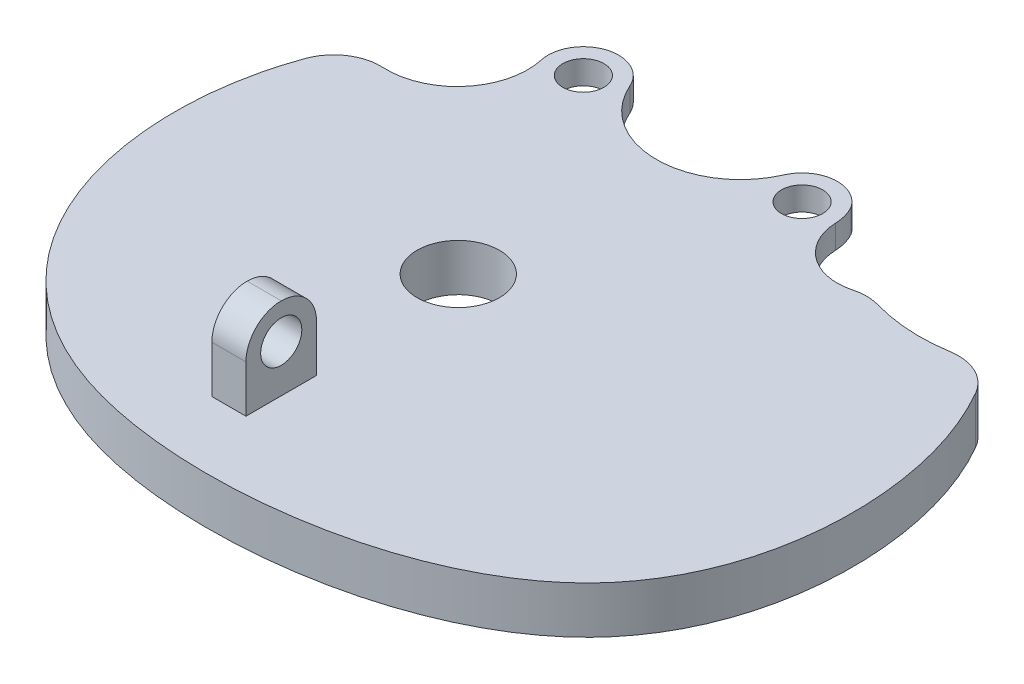
ISO-10303-21;
HEADER;
FILE_DESCRIPTION(('STEP AP214'),'2;1');
FILE_NAME('part.step','',(''),(''),'','','');
FILE_SCHEMA(('AUTOMOTIVE_DESIGN { 1 0 10303 214 1 1 1 1 }'));
ENDSEC;
DATA;
#1=APPLICATION_CONTEXT('core data for automotive mechanical design processes');
#2=APPLICATION_PROTOCOL_DEFINITION('international standard','automotive_design',2000,#1);
#3=PRODUCT_CONTEXT('',#1,'mechanical');
#4=PRODUCT('Part','Part','',(#3));
#5=PRODUCT_RELATED_PRODUCT_CATEGORY('part','',(#4));
#6=PRODUCT_DEFINITION_FORMATION('','',#4);
#7=PRODUCT_DEFINITION_CONTEXT('part definition',#1,'design');
#8=PRODUCT_DEFINITION('design','',#6,#7);
#9=PRODUCT_DEFINITION_SHAPE('','',#8);
#10=(LENGTH_UNIT() NAMED_UNIT(*) SI_UNIT(.MILLI.,.METRE.));
#11=(NAMED_UNIT(*) PLANE_ANGLE_UNIT() SI_UNIT($,.RADIAN.));
#12=(NAMED_UNIT(*) SI_UNIT($,.STERADIAN.) SOLID_ANGLE_UNIT());
#13=UNCERTAINTY_MEASURE_WITH_UNIT(LENGTH_MEASURE(1.E-05),#10,'distance_accuracy_value','');
#14=(GEOMETRIC_REPRESENTATION_CONTEXT(3) GLOBAL_UNCERTAINTY_ASSIGNED_CONTEXT((#13)) GLOBAL_UNIT_ASSIGNED_CONTEXT((#10,
#11,#12)) REPRESENTATION_CONTEXT('',''));
#15=CARTESIAN_POINT('',(0.,0.,0.));
#16=DIRECTION('',(0.,0.,1.));
#17=DIRECTION('',(1.,0.,0.));
#18=AXIS2_PLACEMENT_3D('',#15,#16,#17);
#19=CARTESIAN_POINT('',(11.2410778568125,4.,24.8480606108844));
#20=DIRECTION('',(0.,1.,0.));
#21=DIRECTION('',(0.,0.,1.));
#22=AXIS2_PLACEMENT_3D('',#19,#20,#21);
#23=PLANE('',#22);
#24=CARTESIAN_POINT('',(-5.,4.,-26.));
#25=CARTESIAN_POINT('',(9.30093151482528,4.,-30.4550670898682));
#26=CARTESIAN_POINT('',(37.8139225856591,4.,-21.5057334882719));
#27=CARTESIAN_POINT('',(32.9254211097846,4.,23.6369478182858));
#28=CARTESIAN_POINT('',(-15.2616372431777,4.,29.4250316533555));
#29=CARTESIAN_POINT('',(-30.0009183978605,4.,-3.86306555326061));
#30=CARTESIAN_POINT('',(-16.3596075726111,4.,-22.461222557559));
#31=CARTESIAN_POINT('',(-5.,4.,-26.));
#32=B_SPLINE_CURVE_WITH_KNOTS('',3,(#24,#25,#26,#27,#28,#29,#30,#31),.UNSPECIFIED.,.T.,.F.,(4,1,
1,1,1,4),(0.,0.296836272987513,0.417767995949356,0.576795532589876,0.764215109277391,1.),.UNSPECIFIED.);
#33=CARTESIAN_POINT('',(30.7630592151904,4.,-13.2382216213357));
#34=VERTEX_POINT('',#33);
#35=CARTESIAN_POINT('',(-22.3737749649327,4.,-9.36261428641886));
#36=VERTEX_POINT('',#35);
#37=EDGE_CURVE('E300',#34,#36,#32,.T.);
#38=ORIENTED_EDGE('',*,*,#37,.F.);
#39=CARTESIAN_POINT('',(27.2924419236476,4.,-11.2495497993288));
#40=DIRECTION('',(0.,1.,0.));
#41=DIRECTION('',(0.,0.,1.));
#42=AXIS2_PLACEMENT_3D('',#39,#40,#41);
#43=CIRCLE('',#42,4.);
#44=CARTESIAN_POINT('',(26.6462729956341,4.,-15.1970129994701));
#45=VERTEX_POINT('',#44);
#46=EDGE_CURVE('E474',#34,#45,#43,.T.);
#47=ORIENTED_EDGE('',*,*,#46,.T.);
#48=CARTESIAN_POINT('',(24.2231395155835,4.,-30.));
#49=DIRECTION('',(0.,1.,0.));
#50=DIRECTION('',(0.,0.,1.));
#51=AXIS2_PLACEMENT_3D('',#48,#49,#50);
#52=CIRCLE('',#51,15.);
#53=CARTESIAN_POINT('',(20.1038416036029,4.,-15.5767068700538));
#54=VERTEX_POINT('',#53);
#55=EDGE_CURVE('E240',#54,#45,#52,.T.);
#56=ORIENTED_EDGE('',*,*,#55,.F.);
#57=CARTESIAN_POINT('',(19.005362160408,4.,-11.7304953687349));
#58=DIRECTION('',(0.,1.,0.));
#59=DIRECTION('',(0.,0.,1.));
#60=AXIS2_PLACEMENT_3D('',#57,#58,#59);
#61=CIRCLE('',#60,4.);
#62=CARTESIAN_POINT('',(17.9664160888255,4.,-15.593213461004));
#63=VERTEX_POINT('',#62);
#64=EDGE_CURVE('E478',#54,#63,#61,.T.);
#65=ORIENTED_EDGE('',*,*,#64,.T.);
#66=CARTESIAN_POINT('',(16.7976017582953,4.,-19.9387713148068));
#67=DIRECTION('',(0.,1.,0.));
#68=DIRECTION('',(0.,0.,1.));
#69=AXIS2_PLACEMENT_3D('',#66,#67,#68);
#70=CIRCLE('',#69,4.5);
#71=CARTESIAN_POINT('',(12.3002344144256,4.,-19.7848655829624));
#72=VERTEX_POINT('',#71);
#73=EDGE_CURVE('E237',#72,#63,#70,.T.);
#74=ORIENTED_EDGE('',*,*,#73,.F.);
#75=CARTESIAN_POINT('',(8.30257455320808,4.,-19.6480604879895));
#76=DIRECTION('',(0.,1.,0.));
#77=DIRECTION('',(0.,0.,1.));
#78=AXIS2_PLACEMENT_3D('',#75,#76,#77);
#79=CIRCLE('',#78,4.);
#80=CARTESIAN_POINT('',(11.78519138451,4.,-21.6156427623387));
#81=VERTEX_POINT('',#80);
#82=EDGE_CURVE('E480',#72,#81,#79,.T.);
#83=ORIENTED_EDGE('',*,*,#82,.T.);
#84=CARTESIAN_POINT('',(9.29760175829526,4.,-19.9387713148064));
#85=DIRECTION('',(0.,-1.,0.));
#86=DIRECTION('',(0.,0.,1.));
#87=AXIS2_PLACEMENT_3D('',#84,#85,#86);
#88=CIRCLE('',#87,3.00000000000006);
#89=CARTESIAN_POINT('',(6.54842748458819,4.,-21.1396213523996));
#90=VERTEX_POINT('',#89);
#91=EDGE_CURVE('E251',#90,#81,#88,.T.);
#92=ORIENTED_EDGE('',*,*,#91,.F.);
#93=CARTESIAN_POINT('',(0.,4.,-24.));
#94=DIRECTION('',(0.,1.,0.));
#95=DIRECTION('',(0.,0.,1.));
#96=AXIS2_PLACEMENT_3D('',#93,#94,#95);
#97=CIRCLE('',#96,7.14588472678907);
#98=CARTESIAN_POINT('',(-6.54842748458823,4.,-21.1396213523998));
#99=VERTEX_POINT('',#98);
#100=EDGE_CURVE('E248',#99,#90,#97,.T.);
#101=ORIENTED_EDGE('',*,*,#100,.F.);
#102=CARTESIAN_POINT('',(-9.29760175829526,4.,-19.9387713148068));
#103=DIRECTION('',(0.,-1.,0.));
#104=DIRECTION('',(0.,0.,1.));
#105=AXIS2_PLACEMENT_3D('',#102,#103,#104);
#106=CIRCLE('',#105,3.);
#107=CARTESIAN_POINT('',(-12.2271668718096,4.,-19.2925142098712));
#108=VERTEX_POINT('',#107);
#109=EDGE_CURVE('E245',#108,#99,#106,.T.);
#110=ORIENTED_EDGE('',*,*,#109,.F.);
#111=CARTESIAN_POINT('',(-18.0862970988383,4.,-18.));
#112=DIRECTION('',(0.,1.,0.));
#113=DIRECTION('',(0.,0.,1.));
#114=AXIS2_PLACEMENT_3D('',#111,#112,#113);
#115=CIRCLE('',#114,6.00000000000006);
#116=CARTESIAN_POINT('',(-18.3993854799132,4.,-12.0081742627446));
#117=VERTEX_POINT('',#116);
#118=EDGE_CURVE('E243',#117,#108,#115,.T.);
#119=ORIENTED_EDGE('',*,*,#118,.F.);
#120=CARTESIAN_POINT('',(-18.6081110672965,4.,-8.01362377124099));
#121=DIRECTION('',(0.,1.,0.));
#122=DIRECTION('',(0.,0.,1.));
#123=AXIS2_PLACEMENT_3D('',#120,#121,#122);
#124=CIRCLE('',#123,4.);
#125=EDGE_CURVE('E476',#117,#36,#124,.T.);
#126=ORIENTED_EDGE('',*,*,#125,.T.);
#127=EDGE_LOOP('',(#38,#47,#56,#65,#74,#83,#92,#101,#110,#119,#126));
#128=FACE_BOUND('',#127,.T.);
#129=CARTESIAN_POINT('',(9.29760175829526,4.,-19.9387713148064));
#130=DIRECTION('',(0.,1.,0.));
#131=DIRECTION('',(0.,0.,1.));
#132=AXIS2_PLACEMENT_3D('',#129,#130,#131);
#133=CIRCLE('',#132,1.75);
#134=CARTESIAN_POINT('',(9.29760175829526,4.,-18.1887713148064));
#135=VERTEX_POINT('',#134);
#136=EDGE_CURVE('E286',#135,#135,#133,.T.);
#137=ORIENTED_EDGE('',*,*,#136,.F.);
#138=EDGE_LOOP('',(#137));
#139=FACE_BOUND('',#138,.T.);
#140=CARTESIAN_POINT('',(-9.29760175829525,4.,-19.9387713148064));
#141=DIRECTION('',(0.,1.,0.));
#142=DIRECTION('',(0.,0.,-1.));
#143=AXIS2_PLACEMENT_3D('',#140,#141,#142);
#144=CIRCLE('',#143,1.75);
#145=CARTESIAN_POINT('',(-9.29760175829525,4.,-21.6887713148064));
#146=VERTEX_POINT('',#145);
#147=EDGE_CURVE('E290',#146,#146,#144,.T.);
#148=ORIENTED_EDGE('',*,*,#147,.F.);
#149=EDGE_LOOP('',(#148));
#150=FACE_BOUND('',#149,.T.);
#151=CARTESIAN_POINT('',(0.,4.,0.));
#152=DIRECTION('',(0.,-1.,0.));
#153=DIRECTION('',(0.,0.,-1.));
#154=AXIS2_PLACEMENT_3D('',#151,#152,#153);
#155=CIRCLE('',#154,3.5);
#156=CARTESIAN_POINT('',(0.,4.,-3.5));
#157=VERTEX_POINT('',#156);
#158=EDGE_CURVE('E294',#157,#157,#155,.T.);
#159=ORIENTED_EDGE('',*,*,#158,.T.);
#160=EDGE_LOOP('',(#159));
#161=FACE_BOUND('',#160,.T.);
#162=DIRECTION('',(-1.,0.,0.));
#163=VECTOR('',#162,1.);
#164=CARTESIAN_POINT('',(-1.45,4.,13.5));
#165=LINE('',#164,#163);
#166=CARTESIAN_POINT('',(1.45,4.,13.5));
#167=VERTEX_POINT('',#166);
#168=CARTESIAN_POINT('',(-1.45,4.,13.5));
#169=VERTEX_POINT('',#168);
#170=EDGE_CURVE('E196',#167,#169,#165,.T.);
#171=ORIENTED_EDGE('',*,*,#170,.F.);
#172=DIRECTION('',(0.,0.,-1.));
#173=VECTOR('',#172,1.);
#174=CARTESIAN_POINT('',(1.45,4.,13.5));
#175=LINE('',#174,#173);
#176=CARTESIAN_POINT('',(1.45,4.,19.5));
#177=VERTEX_POINT('',#176);
#178=EDGE_CURVE('E204',#177,#167,#175,.T.);
#179=ORIENTED_EDGE('',*,*,#178,.F.);
#180=DIRECTION('',(1.,0.,0.));
#181=VECTOR('',#180,1.);
#182=CARTESIAN_POINT('',(-1.45,4.,19.5));
#183=LINE('',#182,#181);
#184=CARTESIAN_POINT('',(-1.45,4.,19.5));
#185=VERTEX_POINT('',#184);
#186=EDGE_CURVE('E215',#185,#177,#183,.T.);
#187=ORIENTED_EDGE('',*,*,#186,.F.);
#188=DIRECTION('',(0.,0.,1.));
#189=VECTOR('',#188,1.);
#190=CARTESIAN_POINT('',(-1.45,4.,13.5));
#191=LINE('',#190,#189);
#192=EDGE_CURVE('E213',#169,#185,#191,.T.);
#193=ORIENTED_EDGE('',*,*,#192,.F.);
#194=EDGE_LOOP('',(#171,#179,#187,#193));
#195=FACE_BOUND('',#194,.T.);
#196=ADVANCED_FACE('F33',(#128,#139,#150,#161,#195),#23,.T.);
#197=CARTESIAN_POINT('',(-9.29760175829525,-0.00100000000000013,-19.9387713148064));
#198=DIRECTION('',(0.,1.,0.));
#199=DIRECTION('',(0.,0.,1.));
#200=AXIS2_PLACEMENT_3D('',#197,#198,#199);
#201=CYLINDRICAL_SURFACE('',#200,1.75);
#202=ORIENTED_EDGE('',*,*,#147,.T.);
#203=EDGE_LOOP('',(#202));
#204=FACE_BOUND('',#203,.T.);
#205=CARTESIAN_POINT('',(-9.29760175829525,2.,-19.9387713148064));
#206=DIRECTION('',(0.,-1.,0.));
#207=DIRECTION('',(0.,0.,-1.));
#208=AXIS2_PLACEMENT_3D('',#205,#206,#207);
#209=CIRCLE('',#208,1.75);
#210=CARTESIAN_POINT('',(-9.29760175829525,2.,-21.6887713148064));
#211=VERTEX_POINT('',#210);
#212=EDGE_CURVE('E293',#211,#211,#209,.F.);
#213=ORIENTED_EDGE('',*,*,#212,.F.);
#214=EDGE_LOOP('',(#213));
#215=FACE_BOUND('',#214,.T.);
#216=ADVANCED_FACE('F320',(#204,#215),#201,.F.);
#217=DIRECTION('',(0.,-1.,0.));
#218=VECTOR('',#217,1.);
#219=SURFACE_OF_LINEAR_EXTRUSION('',#32,#218);
#220=CARTESIAN_POINT('',(-5.,0.,-26.));
#221=CARTESIAN_POINT('',(9.30093151482528,0.,-30.4550670898682));
#222=CARTESIAN_POINT('',(37.8139225856591,0.,-21.5057334882719));
#223=CARTESIAN_POINT('',(32.9254211097846,0.,23.6369478182858));
#224=CARTESIAN_POINT('',(-15.2616372431777,0.,29.4250316533555));
#225=CARTESIAN_POINT('',(-30.0009183978605,0.,-3.86306555326061));
#226=CARTESIAN_POINT('',(-16.3596075726111,0.,-22.461222557559));
#227=CARTESIAN_POINT('',(-5.,0.,-26.));
#228=B_SPLINE_CURVE_WITH_KNOTS('',3,(#220,#221,#222,#223,#224,#225,#226,#227),.UNSPECIFIED.,.T.,
.F.,(4,1,1,1,1,4),(0.,0.296836272987513,0.417767995949356,0.576795532589876,0.764215109277391,
1.),.UNSPECIFIED.);
#229=CARTESIAN_POINT('',(30.7630592151904,0.,-13.2382216213357));
#230=VERTEX_POINT('',#229);
#231=CARTESIAN_POINT('',(-22.3737749649275,0.,-9.36261428643321));
#232=VERTEX_POINT('',#231);
#233=EDGE_CURVE('E297',#230,#232,#228,.T.);
#234=ORIENTED_EDGE('',*,*,#233,.F.);
#235=DIRECTION('',(0.,-1.,0.));
#236=VECTOR('',#235,1.);
#237=CARTESIAN_POINT('',(30.7630592151904,0.,-13.2382216213357));
#238=LINE('',#237,#236);
#239=EDGE_CURVE('E482',#230,#34,#238,.F.);
#240=ORIENTED_EDGE('',*,*,#239,.T.);
#241=ORIENTED_EDGE('',*,*,#37,.T.);
#242=DIRECTION('',(0.,-1.,0.));
#243=VECTOR('',#242,1.);
#244=CARTESIAN_POINT('',(-22.3737749649275,4.,-9.36261428643321));
#245=LINE('',#244,#243);
#246=EDGE_CURVE('E485',#36,#232,#245,.T.);
#247=ORIENTED_EDGE('',*,*,#246,.T.);
#248=EDGE_LOOP('',(#234,#240,#241,#247));
#249=FACE_BOUND('',#248,.T.);
#250=ADVANCED_FACE('F315',(#249),#219,.T.);
#251=CARTESIAN_POINT('',(11.2410778568125,0.,24.8480606108844));
#252=DIRECTION('',(0.,1.,0.));
#253=DIRECTION('',(0.,0.,1.));
#254=AXIS2_PLACEMENT_3D('',#251,#252,#253);
#255=PLANE('',#254);
#256=CARTESIAN_POINT('',(0.,0.,0.));
#257=DIRECTION('',(0.,-1.,0.));
#258=DIRECTION('',(0.,0.,-1.));
#259=AXIS2_PLACEMENT_3D('',#256,#257,#258);
#260=CIRCLE('',#259,3.5);
#261=CARTESIAN_POINT('',(0.,0.,-3.5));
#262=VERTEX_POINT('',#261);
#263=EDGE_CURVE('E289',#262,#262,#260,.T.);
#264=ORIENTED_EDGE('',*,*,#263,.F.);
#265=EDGE_LOOP('',(#264));
#266=FACE_BOUND('',#265,.T.);
#267=CARTESIAN_POINT('',(-18.0862970988383,0.,-18.));
#268=DIRECTION('',(0.,1.,0.));
#269=DIRECTION('',(0.,0.,1.));
#270=AXIS2_PLACEMENT_3D('',#267,#268,#269);
#271=CIRCLE('',#270,6.00000000000006);
#272=CARTESIAN_POINT('',(-13.2091865757992,0.,-14.5051762639494));
#273=VERTEX_POINT('',#272);
#274=CARTESIAN_POINT('',(-18.3993854799132,0.,-12.0081742627446));
#275=VERTEX_POINT('',#274);
#276=EDGE_CURVE('E232',#273,#275,#271,.F.);
#277=ORIENTED_EDGE('',*,*,#276,.F.);
#278=CARTESIAN_POINT('',(-9.95777956043989,0.,-12.1752937732491));
#279=DIRECTION('',(0.,1.,0.));
#280=DIRECTION('',(0.,0.,1.));
#281=AXIS2_PLACEMENT_3D('',#278,#279,#280);
#282=CIRCLE('',#281,4.);
#283=CARTESIAN_POINT('',(-10.1892755539933,0.,-16.1685893552175));
#284=VERTEX_POINT('',#283);
#285=EDGE_CURVE('E510',#273,#284,#282,.F.);
#286=ORIENTED_EDGE('',*,*,#285,.T.);
#287=CARTESIAN_POINT('',(-10.5654565435175,0.,-22.6576946759162));
#288=DIRECTION('',(0.,-1.,0.));
#289=DIRECTION('',(0.,0.,-1.));
#290=AXIS2_PLACEMENT_3D('',#287,#288,#289);
#291=CIRCLE('',#290,6.5);
#292=CARTESIAN_POINT('',(-6.96449137793952,0.,-17.2463131631883));
#293=VERTEX_POINT('',#292);
#294=EDGE_CURVE('E278',#293,#284,#291,.T.);
#295=ORIENTED_EDGE('',*,*,#294,.F.);
#296=CARTESIAN_POINT('',(-4.74851281450692,0.,-13.9162322322788));
#297=DIRECTION('',(0.,1.,0.));
#298=DIRECTION('',(0.,0.,1.));
#299=AXIS2_PLACEMENT_3D('',#296,#297,#298);
#300=CIRCLE('',#299,4.);
#301=CARTESIAN_POINT('',(-3.04438149396889,0.,-17.5350630437925));
#302=VERTEX_POINT('',#301);
#303=EDGE_CURVE('E512',#293,#302,#300,.F.);
#304=ORIENTED_EDGE('',*,*,#303,.T.);
#305=CARTESIAN_POINT('',(0.,0.,-24.));
#306=DIRECTION('',(0.,1.,0.));
#307=DIRECTION('',(0.,0.,1.));
#308=AXIS2_PLACEMENT_3D('',#305,#306,#307);
#309=CIRCLE('',#308,7.14588472678907);
#310=CARTESIAN_POINT('',(3.04438149396889,0.,-17.5350630437925));
#311=VERTEX_POINT('',#310);
#312=EDGE_CURVE('E228',#311,#302,#309,.F.);
#313=ORIENTED_EDGE('',*,*,#312,.F.);
#314=CARTESIAN_POINT('',(4.74851281450692,0.,-13.9162322322788));
#315=DIRECTION('',(0.,1.,0.));
#316=DIRECTION('',(0.,0.,1.));
#317=AXIS2_PLACEMENT_3D('',#314,#315,#316);
#318=CIRCLE('',#317,4.);
#319=CARTESIAN_POINT('',(6.96449137793952,0.,-17.2463131631883));
#320=VERTEX_POINT('',#319);
#321=EDGE_CURVE('E514',#311,#320,#318,.F.);
#322=ORIENTED_EDGE('',*,*,#321,.T.);
#323=CARTESIAN_POINT('',(10.5654565435175,0.,-22.6576946759162));
#324=DIRECTION('',(0.,-1.,0.));
#325=DIRECTION('',(0.,0.,1.));
#326=AXIS2_PLACEMENT_3D('',#323,#324,#325);
#327=CIRCLE('',#326,6.5);
#328=CARTESIAN_POINT('',(11.9812068787791,0.,-16.3137486650956));
#329=VERTEX_POINT('',#328);
#330=EDGE_CURVE('E273',#329,#320,#327,.T.);
#331=ORIENTED_EDGE('',*,*,#330,.F.);
#332=CARTESIAN_POINT('',(12.8524378543247,0.,-12.409781889206));
#333=DIRECTION('',(0.,1.,0.));
#334=DIRECTION('',(0.,0.,1.));
#335=AXIS2_PLACEMENT_3D('',#332,#333,#334);
#336=CIRCLE('',#335,4.);
#337=CARTESIAN_POINT('',(14.7089855738403,0.,-15.9528357365476));
#338=VERTEX_POINT('',#337);
#339=EDGE_CURVE('E516',#329,#338,#336,.F.);
#340=ORIENTED_EDGE('',*,*,#339,.T.);
#341=CARTESIAN_POINT('',(16.7976017582953,0.,-19.9387713148068));
#342=DIRECTION('',(0.,1.,0.));
#343=DIRECTION('',(0.,0.,1.));
#344=AXIS2_PLACEMENT_3D('',#341,#342,#343);
#345=CIRCLE('',#344,4.5);
#346=CARTESIAN_POINT('',(17.9664160888255,0.,-15.593213461004));
#347=VERTEX_POINT('',#346);
#348=EDGE_CURVE('E267',#347,#338,#345,.F.);
#349=ORIENTED_EDGE('',*,*,#348,.F.);
#350=CARTESIAN_POINT('',(19.005362160408,0.,-11.7304953687349));
#351=DIRECTION('',(0.,1.,0.));
#352=DIRECTION('',(0.,0.,1.));
#353=AXIS2_PLACEMENT_3D('',#350,#351,#352);
#354=CIRCLE('',#353,4.);
#355=CARTESIAN_POINT('',(20.1038416036029,0.,-15.5767068700538));
#356=VERTEX_POINT('',#355);
#357=EDGE_CURVE('E522',#347,#356,#354,.F.);
#358=ORIENTED_EDGE('',*,*,#357,.T.);
#359=CARTESIAN_POINT('',(24.2231395155835,0.,-30.));
#360=DIRECTION('',(0.,1.,0.));
#361=DIRECTION('',(0.,0.,1.));
#362=AXIS2_PLACEMENT_3D('',#359,#360,#361);
#363=CIRCLE('',#362,15.);
#364=CARTESIAN_POINT('',(26.6462729956341,0.,-15.1970129994701));
#365=VERTEX_POINT('',#364);
#366=EDGE_CURVE('E227',#365,#356,#363,.F.);
#367=ORIENTED_EDGE('',*,*,#366,.F.);
#368=CARTESIAN_POINT('',(27.2924419236476,0.,-11.2495497993288));
#369=DIRECTION('',(0.,1.,0.));
#370=DIRECTION('',(0.,0.,1.));
#371=AXIS2_PLACEMENT_3D('',#368,#369,#370);
#372=CIRCLE('',#371,4.);
#373=EDGE_CURVE('E518',#365,#230,#372,.F.);
#374=ORIENTED_EDGE('',*,*,#373,.T.);
#375=ORIENTED_EDGE('',*,*,#233,.T.);
#376=CARTESIAN_POINT('',(-18.6081110672965,0.,-8.01362377124099));
#377=DIRECTION('',(0.,1.,0.));
#378=DIRECTION('',(0.,0.,1.));
#379=AXIS2_PLACEMENT_3D('',#376,#377,#378);
#380=CIRCLE('',#379,4.);
#381=EDGE_CURVE('E520',#232,#275,#380,.F.);
#382=ORIENTED_EDGE('',*,*,#381,.T.);
#383=EDGE_LOOP('',(#277,#286,#295,#304,#313,#322,#331,#340,#349,#358,#367,#374,#375,#382));
#384=FACE_BOUND('',#383,.T.);
#385=ADVANCED_FACE('F319',(#266,#384),#255,.F.);
#386=CARTESIAN_POINT('',(0.,4.,0.));
#387=DIRECTION('',(0.,-1.,0.));
#388=DIRECTION('',(0.,0.,-1.));
#389=AXIS2_PLACEMENT_3D('',#386,#387,#388);
#390=CYLINDRICAL_SURFACE('',#389,3.5);
#391=ORIENTED_EDGE('',*,*,#158,.F.);
#392=EDGE_LOOP('',(#391));
#393=FACE_BOUND('',#392,.T.);
#394=ORIENTED_EDGE('',*,*,#263,.T.);
#395=EDGE_LOOP('',(#394));
#396=FACE_BOUND('',#395,.T.);
#397=ADVANCED_FACE('F373',(#393,#396),#390,.F.);
#398=CARTESIAN_POINT('',(9.29760175829526,-0.00100000000000013,-19.9387713148064));
#399=DIRECTION('',(0.,1.,0.));
#400=DIRECTION('',(0.,0.,1.));
#401=AXIS2_PLACEMENT_3D('',#398,#399,#400);
#402=CYLINDRICAL_SURFACE('',#401,1.75);
#403=CARTESIAN_POINT('',(9.29760175829526,2.,-19.9387713148064));
#404=DIRECTION('',(0.,1.,0.));
#405=DIRECTION('',(0.,0.,1.));
#406=AXIS2_PLACEMENT_3D('',#403,#404,#405);
#407=CIRCLE('',#406,1.75);
#408=CARTESIAN_POINT('',(9.29760175829526,2.,-18.1887713148064));
#409=VERTEX_POINT('',#408);
#410=EDGE_CURVE('E277',#409,#409,#407,.F.);
#411=ORIENTED_EDGE('',*,*,#410,.T.);
#412=EDGE_LOOP('',(#411));
#413=FACE_BOUND('',#412,.T.);
#414=ORIENTED_EDGE('',*,*,#136,.T.);
#415=EDGE_LOOP('',(#414));
#416=FACE_BOUND('',#415,.T.);
#417=ADVANCED_FACE('F375',(#413,#416),#402,.F.);
#418=CARTESIAN_POINT('',(10.5654565435175,2.,-22.6576946759162));
#419=DIRECTION('',(0.,1.,0.));
#420=DIRECTION('',(0.,0.,1.));
#421=AXIS2_PLACEMENT_3D('',#418,#419,#420);
#422=PLANE('',#421);
#423=CARTESIAN_POINT('',(9.29760175829526,2.,-19.9387713148064));
#424=DIRECTION('',(0.,1.,0.));
#425=DIRECTION('',(0.,0.,1.));
#426=AXIS2_PLACEMENT_3D('',#423,#424,#425);
#427=CIRCLE('',#426,3.00000000000006);
#428=CARTESIAN_POINT('',(11.78519138451,2.,-21.6156427623386));
#429=VERTEX_POINT('',#428);
#430=CARTESIAN_POINT('',(6.54842748458819,2.,-21.1396213523996));
#431=VERTEX_POINT('',#430);
#432=EDGE_CURVE('E200',#429,#431,#427,.T.);
#433=ORIENTED_EDGE('',*,*,#432,.F.);
#434=CARTESIAN_POINT('',(8.30257455320808,2.,-19.6480604879895));
#435=DIRECTION('',(0.,1.,0.));
#436=DIRECTION('',(0.,0.,1.));
#437=AXIS2_PLACEMENT_3D('',#434,#435,#436);
#438=CIRCLE('',#437,4.);
#439=CARTESIAN_POINT('',(12.3002344144256,2.,-19.7848655829624));
#440=VERTEX_POINT('',#439);
#441=EDGE_CURVE('E467',#429,#440,#438,.F.);
#442=ORIENTED_EDGE('',*,*,#441,.T.);
#443=CARTESIAN_POINT('',(16.7976017582953,2.,-19.9387713148068));
#444=DIRECTION('',(0.,1.,0.));
#445=DIRECTION('',(0.,0.,1.));
#446=AXIS2_PLACEMENT_3D('',#443,#444,#445);
#447=CIRCLE('',#446,4.5);
#448=CARTESIAN_POINT('',(14.7089855738403,2.,-15.9528357365476));
#449=VERTEX_POINT('',#448);
#450=EDGE_CURVE('E258',#449,#440,#447,.F.);
#451=ORIENTED_EDGE('',*,*,#450,.F.);
#452=CARTESIAN_POINT('',(12.8524378543247,2.,-12.409781889206));
#453=DIRECTION('',(0.,1.,0.));
#454=DIRECTION('',(0.,0.,1.));
#455=AXIS2_PLACEMENT_3D('',#452,#453,#454);
#456=CIRCLE('',#455,4.);
#457=CARTESIAN_POINT('',(11.9812068787791,2.,-16.3137486650956));
#458=VERTEX_POINT('',#457);
#459=EDGE_CURVE('E457',#449,#458,#456,.T.);
#460=ORIENTED_EDGE('',*,*,#459,.T.);
#461=CARTESIAN_POINT('',(10.5654565435175,2.,-22.6576946759162));
#462=DIRECTION('',(0.,-1.,0.));
#463=DIRECTION('',(0.,0.,1.));
#464=AXIS2_PLACEMENT_3D('',#461,#462,#463);
#465=CIRCLE('',#464,6.5);
#466=CARTESIAN_POINT('',(6.96449137793952,2.,-17.2463131631883));
#467=VERTEX_POINT('',#466);
#468=EDGE_CURVE('E281',#458,#467,#465,.T.);
#469=ORIENTED_EDGE('',*,*,#468,.T.);
#470=CARTESIAN_POINT('',(4.74851281450692,2.,-13.9162322322788));
#471=DIRECTION('',(0.,1.,0.));
#472=DIRECTION('',(0.,0.,1.));
#473=AXIS2_PLACEMENT_3D('',#470,#471,#472);
#474=CIRCLE('',#473,4.);
#475=CARTESIAN_POINT('',(3.04438149396889,2.,-17.5350630437925));
#476=VERTEX_POINT('',#475);
#477=EDGE_CURVE('E459',#467,#476,#474,.T.);
#478=ORIENTED_EDGE('',*,*,#477,.T.);
#479=CARTESIAN_POINT('',(0.,2.,-24.));
#480=DIRECTION('',(0.,1.,0.));
#481=DIRECTION('',(0.,0.,1.));
#482=AXIS2_PLACEMENT_3D('',#479,#480,#481);
#483=CIRCLE('',#482,7.14588472678907);
#484=EDGE_CURVE('E225',#431,#476,#483,.F.);
#485=ORIENTED_EDGE('',*,*,#484,.F.);
#486=EDGE_LOOP('',(#433,#442,#451,#460,#469,#478,#485));
#487=FACE_BOUND('',#486,.T.);
#488=ORIENTED_EDGE('',*,*,#410,.F.);
#489=EDGE_LOOP('',(#488));
#490=FACE_BOUND('',#489,.T.);
#491=ADVANCED_FACE('F380',(#487,#490),#422,.F.);
#492=CARTESIAN_POINT('',(10.5654565435175,2.,-22.6576946759162));
#493=DIRECTION('',(0.,-1.,0.));
#494=DIRECTION('',(0.,0.,-1.));
#495=AXIS2_PLACEMENT_3D('',#492,#493,#494);
#496=CYLINDRICAL_SURFACE('',#495,6.5);
#497=ORIENTED_EDGE('',*,*,#330,.T.);
#498=DIRECTION('',(0.,-1.,0.));
#499=VECTOR('',#498,1.);
#500=CARTESIAN_POINT('',(6.96449137793952,2.,-17.2463131631883));
#501=LINE('',#500,#499);
#502=EDGE_CURVE('E496',#320,#467,#501,.F.);
#503=ORIENTED_EDGE('',*,*,#502,.T.);
#504=ORIENTED_EDGE('',*,*,#468,.F.);
#505=DIRECTION('',(0.,-1.,0.));
#506=VECTOR('',#505,1.);
#507=CARTESIAN_POINT('',(11.9812068787791,2.,-16.3137486650956));
#508=LINE('',#507,#506);
#509=EDGE_CURVE('E498',#458,#329,#508,.T.);
#510=ORIENTED_EDGE('',*,*,#509,.T.);
#511=EDGE_LOOP('',(#497,#503,#504,#510));
#512=FACE_BOUND('',#511,.T.);
#513=ADVANCED_FACE('F382',(#512),#496,.F.);
#514=CARTESIAN_POINT('',(-10.5654565435175,2.,-22.6576946759162));
#515=DIRECTION('',(0.,-1.,0.));
#516=DIRECTION('',(0.,0.,-1.));
#517=AXIS2_PLACEMENT_3D('',#514,#515,#516);
#518=PLANE('',#517);
#519=CARTESIAN_POINT('',(0.,2.,-24.));
#520=DIRECTION('',(0.,-1.,0.));
#521=DIRECTION('',(0.,0.,-1.));
#522=AXIS2_PLACEMENT_3D('',#519,#520,#521);
#523=CIRCLE('',#522,7.14588472678907);
#524=CARTESIAN_POINT('',(-6.54842748458821,2.,-21.1396213523999));
#525=VERTEX_POINT('',#524);
#526=CARTESIAN_POINT('',(-3.04438149396889,2.,-17.5350630437925));
#527=VERTEX_POINT('',#526);
#528=EDGE_CURVE('E235',#525,#527,#523,.F.);
#529=ORIENTED_EDGE('',*,*,#528,.T.);
#530=CARTESIAN_POINT('',(-4.74851281450692,2.,-13.9162322322788));
#531=DIRECTION('',(0.,-1.,0.));
#532=DIRECTION('',(0.,0.,-1.));
#533=AXIS2_PLACEMENT_3D('',#530,#531,#532);
#534=CIRCLE('',#533,4.);
#535=CARTESIAN_POINT('',(-6.96449137793952,2.,-17.2463131631883));
#536=VERTEX_POINT('',#535);
#537=EDGE_CURVE('E462',#527,#536,#534,.F.);
#538=ORIENTED_EDGE('',*,*,#537,.T.);
#539=CARTESIAN_POINT('',(-10.5654565435175,2.,-22.6576946759162));
#540=DIRECTION('',(0.,-1.,0.));
#541=DIRECTION('',(0.,0.,-1.));
#542=AXIS2_PLACEMENT_3D('',#539,#540,#541);
#543=CIRCLE('',#542,6.5);
#544=CARTESIAN_POINT('',(-10.1892755539933,2.,-16.1685893552175));
#545=VERTEX_POINT('',#544);
#546=EDGE_CURVE('E274',#536,#545,#543,.T.);
#547=ORIENTED_EDGE('',*,*,#546,.T.);
#548=CARTESIAN_POINT('',(-9.95777956043989,2.,-12.1752937732491));
#549=DIRECTION('',(0.,-1.,0.));
#550=DIRECTION('',(0.,0.,-1.));
#551=AXIS2_PLACEMENT_3D('',#548,#549,#550);
#552=CIRCLE('',#551,4.);
#553=CARTESIAN_POINT('',(-13.2091865757992,2.,-14.5051762639494));
#554=VERTEX_POINT('',#553);
#555=EDGE_CURVE('E464',#545,#554,#552,.F.);
#556=ORIENTED_EDGE('',*,*,#555,.T.);
#557=CARTESIAN_POINT('',(-18.0862970988383,2.,-18.));
#558=DIRECTION('',(0.,-1.,0.));
#559=DIRECTION('',(0.,0.,-1.));
#560=AXIS2_PLACEMENT_3D('',#557,#558,#559);
#561=CIRCLE('',#560,6.00000000000006);
#562=CARTESIAN_POINT('',(-12.2271668718095,2.,-19.2925142098712));
#563=VERTEX_POINT('',#562);
#564=EDGE_CURVE('E270',#554,#563,#561,.F.);
#565=ORIENTED_EDGE('',*,*,#564,.T.);
#566=CARTESIAN_POINT('',(-9.29760175829526,2.,-19.9387713148068));
#567=DIRECTION('',(0.,-1.,0.));
#568=DIRECTION('',(0.,0.,-1.));
#569=AXIS2_PLACEMENT_3D('',#566,#567,#568);
#570=CIRCLE('',#569,3.);
#571=EDGE_CURVE('E231',#563,#525,#570,.T.);
#572=ORIENTED_EDGE('',*,*,#571,.T.);
#573=EDGE_LOOP('',(#529,#538,#547,#556,#565,#572));
#574=FACE_BOUND('',#573,.T.);
#575=ORIENTED_EDGE('',*,*,#212,.T.);
#576=EDGE_LOOP('',(#575));
#577=FACE_BOUND('',#576,.T.);
#578=ADVANCED_FACE('F385',(#574,#577),#518,.T.);
#579=CARTESIAN_POINT('',(-10.5654565435175,2.,-22.6576946759162));
#580=DIRECTION('',(0.,-1.,0.));
#581=DIRECTION('',(0.,0.,-1.));
#582=AXIS2_PLACEMENT_3D('',#579,#580,#581);
#583=CYLINDRICAL_SURFACE('',#582,6.5);
#584=ORIENTED_EDGE('',*,*,#294,.T.);
#585=DIRECTION('',(0.,-1.,0.));
#586=VECTOR('',#585,1.);
#587=CARTESIAN_POINT('',(-10.1892755539933,2.,-16.1685893552175));
#588=LINE('',#587,#586);
#589=EDGE_CURVE('E506',#284,#545,#588,.F.);
#590=ORIENTED_EDGE('',*,*,#589,.T.);
#591=ORIENTED_EDGE('',*,*,#546,.F.);
#592=DIRECTION('',(0.,-1.,0.));
#593=VECTOR('',#592,1.);
#594=CARTESIAN_POINT('',(-6.96449137793952,2.,-17.2463131631883));
#595=LINE('',#594,#593);
#596=EDGE_CURVE('E508',#536,#293,#595,.T.);
#597=ORIENTED_EDGE('',*,*,#596,.T.);
#598=EDGE_LOOP('',(#584,#590,#591,#597));
#599=FACE_BOUND('',#598,.T.);
#600=ADVANCED_FACE('F390',(#599),#583,.F.);
#601=CARTESIAN_POINT('',(9.29760175829526,-0.00100000000000013,-19.9387713148064));
#602=DIRECTION('',(0.,1.,0.));
#603=DIRECTION('',(0.,0.,1.));
#604=AXIS2_PLACEMENT_3D('',#601,#602,#603);
#605=CYLINDRICAL_SURFACE('',#604,3.00000000000006);
#606=ORIENTED_EDGE('',*,*,#432,.T.);
#607=DIRECTION('',(0.,1.,0.));
#608=VECTOR('',#607,1.);
#609=CARTESIAN_POINT('',(6.54842748458819,-0.00100000000000013,-21.1396213523996));
#610=LINE('',#609,#608);
#611=EDGE_CURVE('E259',#431,#90,#610,.T.);
#612=ORIENTED_EDGE('',*,*,#611,.T.);
#613=ORIENTED_EDGE('',*,*,#91,.T.);
#614=DIRECTION('',(0.,1.,0.));
#615=VECTOR('',#614,1.);
#616=CARTESIAN_POINT('',(11.78519138451,-0.00100000000000013,-21.6156427623387));
#617=LINE('',#616,#615);
#618=EDGE_CURVE('E255',#429,#81,#617,.T.);
#619=ORIENTED_EDGE('',*,*,#618,.F.);
#620=EDGE_LOOP('',(#606,#612,#613,#619));
#621=FACE_BOUND('',#620,.T.);
#622=ADVANCED_FACE('F393',(#621),#605,.T.);
#623=CARTESIAN_POINT('',(0.,-0.00100000000000013,-24.));
#624=DIRECTION('',(0.,1.,0.));
#625=DIRECTION('',(0.,0.,1.));
#626=AXIS2_PLACEMENT_3D('',#623,#624,#625);
#627=CYLINDRICAL_SURFACE('',#626,7.14588472678907);
#628=ORIENTED_EDGE('',*,*,#312,.T.);
#629=DIRECTION('',(0.,1.,0.));
#630=VECTOR('',#629,1.);
#631=CARTESIAN_POINT('',(-3.04438149396889,-0.00100000000000013,-17.5350630437925));
#632=LINE('',#631,#630);
#633=EDGE_CURVE('E500',#302,#527,#632,.T.);
#634=ORIENTED_EDGE('',*,*,#633,.T.);
#635=ORIENTED_EDGE('',*,*,#528,.F.);
#636=DIRECTION('',(0.,1.,0.));
#637=VECTOR('',#636,1.);
#638=CARTESIAN_POINT('',(-6.54842748458823,-0.00100000000000013,-21.1396213523998));
#639=LINE('',#638,#637);
#640=EDGE_CURVE('E261',#525,#99,#639,.T.);
#641=ORIENTED_EDGE('',*,*,#640,.T.);
#642=ORIENTED_EDGE('',*,*,#100,.T.);
#643=ORIENTED_EDGE('',*,*,#611,.F.);
#644=ORIENTED_EDGE('',*,*,#484,.T.);
#645=DIRECTION('',(0.,1.,0.));
#646=VECTOR('',#645,1.);
#647=CARTESIAN_POINT('',(3.04438149396889,-0.00100000000000013,-17.5350630437925));
#648=LINE('',#647,#646);
#649=EDGE_CURVE('E503',#476,#311,#648,.F.);
#650=ORIENTED_EDGE('',*,*,#649,.T.);
#651=EDGE_LOOP('',(#628,#634,#635,#641,#642,#643,#644,#650));
#652=FACE_BOUND('',#651,.T.);
#653=ADVANCED_FACE('F402',(#652),#627,.F.);
#654=CARTESIAN_POINT('',(16.7976017582953,-0.00100000000000013,-19.9387713148068));
#655=DIRECTION('',(0.,1.,0.));
#656=DIRECTION('',(0.,0.,1.));
#657=AXIS2_PLACEMENT_3D('',#654,#655,#656);
#658=CYLINDRICAL_SURFACE('',#657,4.5);
#659=ORIENTED_EDGE('',*,*,#348,.T.);
#660=DIRECTION('',(0.,1.,0.));
#661=VECTOR('',#660,1.);
#662=CARTESIAN_POINT('',(14.7089855738403,-0.00100000000000013,-15.9528357365476));
#663=LINE('',#662,#661);
#664=EDGE_CURVE('E488',#338,#449,#663,.T.);
#665=ORIENTED_EDGE('',*,*,#664,.T.);
#666=ORIENTED_EDGE('',*,*,#450,.T.);
#667=DIRECTION('',(0.,1.,0.));
#668=VECTOR('',#667,1.);
#669=CARTESIAN_POINT('',(12.3002344144256,-0.00100000000000013,-19.7848655829624));
#670=LINE('',#669,#668);
#671=EDGE_CURVE('E493',#440,#72,#670,.T.);
#672=ORIENTED_EDGE('',*,*,#671,.T.);
#673=ORIENTED_EDGE('',*,*,#73,.T.);
#674=DIRECTION('',(0.,1.,0.));
#675=VECTOR('',#674,1.);
#676=CARTESIAN_POINT('',(17.9664160888255,-0.00100000000000013,-15.593213461004));
#677=LINE('',#676,#675);
#678=EDGE_CURVE('E491',#63,#347,#677,.F.);
#679=ORIENTED_EDGE('',*,*,#678,.T.);
#680=EDGE_LOOP('',(#659,#665,#666,#672,#673,#679));
#681=FACE_BOUND('',#680,.T.);
#682=ADVANCED_FACE('F398',(#681),#658,.F.);
#683=CARTESIAN_POINT('',(-9.29760175829526,-0.00100000000000013,-19.9387713148068));
#684=DIRECTION('',(0.,1.,0.));
#685=DIRECTION('',(0.,0.,1.));
#686=AXIS2_PLACEMENT_3D('',#683,#684,#685);
#687=CYLINDRICAL_SURFACE('',#686,3.);
#688=DIRECTION('',(0.,1.,0.));
#689=VECTOR('',#688,1.);
#690=CARTESIAN_POINT('',(-12.2271668718096,-0.00100000000000013,-19.2925142098712));
#691=LINE('',#690,#689);
#692=EDGE_CURVE('E254',#563,#108,#691,.T.);
#693=ORIENTED_EDGE('',*,*,#692,.T.);
#694=ORIENTED_EDGE('',*,*,#109,.T.);
#695=ORIENTED_EDGE('',*,*,#640,.F.);
#696=ORIENTED_EDGE('',*,*,#571,.F.);
#697=EDGE_LOOP('',(#693,#694,#695,#696));
#698=FACE_BOUND('',#697,.T.);
#699=ADVANCED_FACE('F401',(#698),#687,.T.);
#700=CARTESIAN_POINT('',(-18.0862970988383,-0.00100000000000013,-18.));
#701=DIRECTION('',(0.,1.,0.));
#702=DIRECTION('',(0.,0.,1.));
#703=AXIS2_PLACEMENT_3D('',#700,#701,#702);
#704=CYLINDRICAL_SURFACE('',#703,6.00000000000006);
#705=ORIENTED_EDGE('',*,*,#564,.F.);
#706=DIRECTION('',(0.,1.,0.));
#707=VECTOR('',#706,1.);
#708=CARTESIAN_POINT('',(-13.2091865757992,-0.00100000000000013,-14.5051762639494));
#709=LINE('',#708,#707);
#710=EDGE_CURVE('E524',#554,#273,#709,.F.);
#711=ORIENTED_EDGE('',*,*,#710,.T.);
#712=ORIENTED_EDGE('',*,*,#276,.T.);
#713=DIRECTION('',(0.,1.,0.));
#714=VECTOR('',#713,1.);
#715=CARTESIAN_POINT('',(-18.3993854799132,-0.00100000000000013,-12.0081742627446));
#716=LINE('',#715,#714);
#717=EDGE_CURVE('E306',#275,#117,#716,.T.);
#718=ORIENTED_EDGE('',*,*,#717,.T.);
#719=ORIENTED_EDGE('',*,*,#118,.T.);
#720=ORIENTED_EDGE('',*,*,#692,.F.);
#721=EDGE_LOOP('',(#705,#711,#712,#718,#719,#720));
#722=FACE_BOUND('',#721,.T.);
#723=ADVANCED_FACE('F406',(#722),#704,.F.);
#724=CARTESIAN_POINT('',(24.2231395155835,-0.00100000000000013,-30.));
#725=DIRECTION('',(0.,1.,0.));
#726=DIRECTION('',(0.,0.,1.));
#727=AXIS2_PLACEMENT_3D('',#724,#725,#726);
#728=CYLINDRICAL_SURFACE('',#727,15.);
#729=ORIENTED_EDGE('',*,*,#55,.T.);
#730=DIRECTION('',(0.,1.,0.));
#731=VECTOR('',#730,1.);
#732=CARTESIAN_POINT('',(26.6462729956341,-0.00100000000000013,-15.1970129994701));
#733=LINE('',#732,#731);
#734=EDGE_CURVE('E469',#45,#365,#733,.F.);
#735=ORIENTED_EDGE('',*,*,#734,.T.);
#736=ORIENTED_EDGE('',*,*,#366,.T.);
#737=DIRECTION('',(0.,1.,0.));
#738=VECTOR('',#737,1.);
#739=CARTESIAN_POINT('',(20.1038416036029,-0.00100000000000013,-15.5767068700538));
#740=LINE('',#739,#738);
#741=EDGE_CURVE('E471',#356,#54,#740,.T.);
#742=ORIENTED_EDGE('',*,*,#741,.T.);
#743=EDGE_LOOP('',(#729,#735,#736,#742));
#744=FACE_BOUND('',#743,.T.);
#745=ADVANCED_FACE('F327',(#744),#728,.F.);
#746=CARTESIAN_POINT('',(-9.95777956043989,2.,-12.1752937732491));
#747=DIRECTION('',(0.,-1.,0.));
#748=DIRECTION('',(0.,0.,-1.));
#749=AXIS2_PLACEMENT_3D('',#746,#747,#748);
#750=CYLINDRICAL_SURFACE('',#749,4.);
#751=ORIENTED_EDGE('',*,*,#555,.F.);
#752=ORIENTED_EDGE('',*,*,#589,.F.);
#753=ORIENTED_EDGE('',*,*,#285,.F.);
#754=ORIENTED_EDGE('',*,*,#710,.F.);
#755=EDGE_LOOP('',(#751,#752,#753,#754));
#756=FACE_BOUND('',#755,.T.);
#757=ADVANCED_FACE('F323',(#756),#750,.T.);
#758=CARTESIAN_POINT('',(-4.74851281450692,2.,-13.9162322322788));
#759=DIRECTION('',(0.,1.,0.));
#760=DIRECTION('',(0.,0.,1.));
#761=AXIS2_PLACEMENT_3D('',#758,#759,#760);
#762=CYLINDRICAL_SURFACE('',#761,4.);
#763=ORIENTED_EDGE('',*,*,#303,.F.);
#764=ORIENTED_EDGE('',*,*,#596,.F.);
#765=ORIENTED_EDGE('',*,*,#537,.F.);
#766=ORIENTED_EDGE('',*,*,#633,.F.);
#767=EDGE_LOOP('',(#763,#764,#765,#766));
#768=FACE_BOUND('',#767,.T.);
#769=ADVANCED_FACE('F326',(#768),#762,.T.);
#770=CARTESIAN_POINT('',(4.74851281450692,2.,-13.9162322322788));
#771=DIRECTION('',(0.,-1.,0.));
#772=DIRECTION('',(0.,0.,-1.));
#773=AXIS2_PLACEMENT_3D('',#770,#771,#772);
#774=CYLINDRICAL_SURFACE('',#773,4.);
#775=ORIENTED_EDGE('',*,*,#477,.F.);
#776=ORIENTED_EDGE('',*,*,#502,.F.);
#777=ORIENTED_EDGE('',*,*,#321,.F.);
#778=ORIENTED_EDGE('',*,*,#649,.F.);
#779=EDGE_LOOP('',(#775,#776,#777,#778));
#780=FACE_BOUND('',#779,.T.);
#781=ADVANCED_FACE('F331',(#780),#774,.T.);
#782=CARTESIAN_POINT('',(12.8524378543247,2.,-12.409781889206));
#783=DIRECTION('',(0.,1.,0.));
#784=DIRECTION('',(0.,0.,1.));
#785=AXIS2_PLACEMENT_3D('',#782,#783,#784);
#786=CYLINDRICAL_SURFACE('',#785,4.);
#787=ORIENTED_EDGE('',*,*,#339,.F.);
#788=ORIENTED_EDGE('',*,*,#509,.F.);
#789=ORIENTED_EDGE('',*,*,#459,.F.);
#790=ORIENTED_EDGE('',*,*,#664,.F.);
#791=EDGE_LOOP('',(#787,#788,#789,#790));
#792=FACE_BOUND('',#791,.T.);
#793=ADVANCED_FACE('F335',(#792),#786,.T.);
#794=CARTESIAN_POINT('',(27.2924419236476,2.,-11.2495497993288));
#795=DIRECTION('',(0.,-1.,0.));
#796=DIRECTION('',(0.,0.,-1.));
#797=AXIS2_PLACEMENT_3D('',#794,#795,#796);
#798=CYLINDRICAL_SURFACE('',#797,4.);
#799=ORIENTED_EDGE('',*,*,#373,.F.);
#800=ORIENTED_EDGE('',*,*,#734,.F.);
#801=ORIENTED_EDGE('',*,*,#46,.F.);
#802=ORIENTED_EDGE('',*,*,#239,.F.);
#803=EDGE_LOOP('',(#799,#800,#801,#802));
#804=FACE_BOUND('',#803,.T.);
#805=ADVANCED_FACE('F339',(#804),#798,.T.);
#806=CARTESIAN_POINT('',(-18.6081110672965,2.,-8.01362377124099));
#807=DIRECTION('',(0.,-1.,0.));
#808=DIRECTION('',(0.,0.,-1.));
#809=AXIS2_PLACEMENT_3D('',#806,#807,#808);
#810=CYLINDRICAL_SURFACE('',#809,4.);
#811=ORIENTED_EDGE('',*,*,#125,.F.);
#812=ORIENTED_EDGE('',*,*,#717,.F.);
#813=ORIENTED_EDGE('',*,*,#381,.F.);
#814=ORIENTED_EDGE('',*,*,#246,.F.);
#815=EDGE_LOOP('',(#811,#812,#813,#814));
#816=FACE_BOUND('',#815,.T.);
#817=ADVANCED_FACE('F343',(#816),#810,.T.);
#818=CARTESIAN_POINT('',(19.005362160408,-0.00100000000000013,-11.7304953687349));
#819=DIRECTION('',(0.,1.,0.));
#820=DIRECTION('',(0.,0.,1.));
#821=AXIS2_PLACEMENT_3D('',#818,#819,#820);
#822=CYLINDRICAL_SURFACE('',#821,4.);
#823=ORIENTED_EDGE('',*,*,#357,.F.);
#824=ORIENTED_EDGE('',*,*,#678,.F.);
#825=ORIENTED_EDGE('',*,*,#64,.F.);
#826=ORIENTED_EDGE('',*,*,#741,.F.);
#827=EDGE_LOOP('',(#823,#824,#825,#826));
#828=FACE_BOUND('',#827,.T.);
#829=ADVANCED_FACE('F347',(#828),#822,.T.);
#830=CARTESIAN_POINT('',(8.30257455320808,-0.00100000000000013,-19.6480604879895));
#831=DIRECTION('',(0.,1.,0.));
#832=DIRECTION('',(0.,0.,1.));
#833=AXIS2_PLACEMENT_3D('',#830,#831,#832);
#834=CYLINDRICAL_SURFACE('',#833,4.);
#835=ORIENTED_EDGE('',*,*,#441,.F.);
#836=ORIENTED_EDGE('',*,*,#618,.T.);
#837=ORIENTED_EDGE('',*,*,#82,.F.);
#838=ORIENTED_EDGE('',*,*,#671,.F.);
#839=EDGE_LOOP('',(#835,#836,#837,#838));
#840=FACE_BOUND('',#839,.T.);
#841=ADVANCED_FACE('F351',(#840),#834,.T.);
#842=CARTESIAN_POINT('',(1.45,11.,13.5));
#843=DIRECTION('',(-1.,0.,0.));
#844=DIRECTION('',(0.,0.,1.));
#845=AXIS2_PLACEMENT_3D('',#842,#843,#844);
#846=PLANE('',#845);
#847=CARTESIAN_POINT('',(1.45,8.,16.5));
#848=DIRECTION('',(1.,0.,0.));
#849=DIRECTION('',(0.,0.,-1.));
#850=AXIS2_PLACEMENT_3D('',#847,#848,#849);
#851=CIRCLE('',#850,1.75);
#852=CARTESIAN_POINT('',(1.45,8.,14.75));
#853=VERTEX_POINT('',#852);
#854=EDGE_CURVE('E440',#853,#853,#851,.T.);
#855=ORIENTED_EDGE('',*,*,#854,.F.);
#856=EDGE_LOOP('',(#855));
#857=FACE_BOUND('',#856,.T.);
#858=DIRECTION('',(0.,-1.,0.));
#859=VECTOR('',#858,1.);
#860=CARTESIAN_POINT('',(1.45,11.,13.5));
#861=LINE('',#860,#859);
#862=CARTESIAN_POINT('',(1.45,8.,13.5));
#863=VERTEX_POINT('',#862);
#864=EDGE_CURVE('E191',#863,#167,#861,.T.);
#865=ORIENTED_EDGE('',*,*,#864,.F.);
#866=CARTESIAN_POINT('',(1.45,8.,16.5));
#867=DIRECTION('',(-1.,0.,0.));
#868=DIRECTION('',(0.,0.,1.));
#869=AXIS2_PLACEMENT_3D('',#866,#867,#868);
#870=CIRCLE('',#869,3.);
#871=CARTESIAN_POINT('',(1.45,11.,16.5));
#872=VERTEX_POINT('',#871);
#873=EDGE_CURVE('E42',#863,#872,#870,.F.);
#874=ORIENTED_EDGE('',*,*,#873,.T.);
#875=CARTESIAN_POINT('',(1.45,8.,16.5));
#876=DIRECTION('',(-1.,0.,0.));
#877=DIRECTION('',(0.,0.,1.));
#878=AXIS2_PLACEMENT_3D('',#875,#876,#877);
#879=CIRCLE('',#878,3.);
#880=CARTESIAN_POINT('',(1.45,8.,19.5));
#881=VERTEX_POINT('',#880);
#882=EDGE_CURVE('E49',#872,#881,#879,.F.);
#883=ORIENTED_EDGE('',*,*,#882,.T.);
#884=DIRECTION('',(0.,-1.,0.));
#885=VECTOR('',#884,1.);
#886=CARTESIAN_POINT('',(1.45,11.,19.5));
#887=LINE('',#886,#885);
#888=EDGE_CURVE('E206',#881,#177,#887,.T.);
#889=ORIENTED_EDGE('',*,*,#888,.T.);
#890=ORIENTED_EDGE('',*,*,#178,.T.);
#891=EDGE_LOOP('',(#865,#874,#883,#889,#890));
#892=FACE_BOUND('',#891,.T.);
#893=ADVANCED_FACE('F205',(#857,#892),#846,.F.);
#894=CARTESIAN_POINT('',(-1.45,11.,13.5));
#895=DIRECTION('',(0.,0.,1.));
#896=DIRECTION('',(1.,0.,0.));
#897=AXIS2_PLACEMENT_3D('',#894,#895,#896);
#898=PLANE('',#897);
#899=DIRECTION('',(0.,-1.,0.));
#900=VECTOR('',#899,1.);
#901=CARTESIAN_POINT('',(-1.45,11.,13.5));
#902=LINE('',#901,#900);
#903=CARTESIAN_POINT('',(-1.45,8.,13.5));
#904=VERTEX_POINT('',#903);
#905=EDGE_CURVE('E201',#904,#169,#902,.T.);
#906=ORIENTED_EDGE('',*,*,#905,.F.);
#907=DIRECTION('',(-1.,0.,0.));
#908=VECTOR('',#907,1.);
#909=CARTESIAN_POINT('',(1.45,8.,13.5));
#910=LINE('',#909,#908);
#911=EDGE_CURVE('E199',#904,#863,#910,.F.);
#912=ORIENTED_EDGE('',*,*,#911,.T.);
#913=ORIENTED_EDGE('',*,*,#864,.T.);
#914=ORIENTED_EDGE('',*,*,#170,.T.);
#915=EDGE_LOOP('',(#906,#912,#913,#914));
#916=FACE_BOUND('',#915,.T.);
#917=ADVANCED_FACE('F194',(#916),#898,.F.);
#918=CARTESIAN_POINT('',(-1.45,11.,13.5));
#919=DIRECTION('',(1.,0.,0.));
#920=DIRECTION('',(0.,0.,-1.));
#921=AXIS2_PLACEMENT_3D('',#918,#919,#920);
#922=PLANE('',#921);
#923=CARTESIAN_POINT('',(-1.45,8.,16.5));
#924=DIRECTION('',(1.,0.,0.));
#925=DIRECTION('',(0.,0.,-1.));
#926=AXIS2_PLACEMENT_3D('',#923,#924,#925);
#927=CIRCLE('',#926,1.75);
#928=CARTESIAN_POINT('',(-1.45,8.,14.75));
#929=VERTEX_POINT('',#928);
#930=EDGE_CURVE('E210',#929,#929,#927,.F.);
#931=ORIENTED_EDGE('',*,*,#930,.F.);
#932=EDGE_LOOP('',(#931));
#933=FACE_BOUND('',#932,.T.);
#934=CARTESIAN_POINT('',(-1.45,8.,16.5));
#935=DIRECTION('',(1.,0.,0.));
#936=DIRECTION('',(0.,0.,-1.));
#937=AXIS2_PLACEMENT_3D('',#934,#935,#936);
#938=CIRCLE('',#937,3.);
#939=CARTESIAN_POINT('',(-1.45,8.,19.5));
#940=VERTEX_POINT('',#939);
#941=CARTESIAN_POINT('',(-1.45,11.,16.5));
#942=VERTEX_POINT('',#941);
#943=EDGE_CURVE('E450',#940,#942,#938,.F.);
#944=ORIENTED_EDGE('',*,*,#943,.T.);
#945=CARTESIAN_POINT('',(-1.45,8.,16.5));
#946=DIRECTION('',(1.,0.,0.));
#947=DIRECTION('',(0.,0.,-1.));
#948=AXIS2_PLACEMENT_3D('',#945,#946,#947);
#949=CIRCLE('',#948,3.);
#950=EDGE_CURVE('E447',#942,#904,#949,.F.);
#951=ORIENTED_EDGE('',*,*,#950,.T.);
#952=ORIENTED_EDGE('',*,*,#905,.T.);
#953=ORIENTED_EDGE('',*,*,#192,.T.);
#954=DIRECTION('',(0.,-1.,0.));
#955=VECTOR('',#954,1.);
#956=CARTESIAN_POINT('',(-1.45,11.,19.5));
#957=LINE('',#956,#955);
#958=EDGE_CURVE('E221',#940,#185,#957,.T.);
#959=ORIENTED_EDGE('',*,*,#958,.F.);
#960=EDGE_LOOP('',(#944,#951,#952,#953,#959));
#961=FACE_BOUND('',#960,.T.);
#962=ADVANCED_FACE('F425',(#933,#961),#922,.F.);
#963=CARTESIAN_POINT('',(-1.45,11.,19.5));
#964=DIRECTION('',(0.,0.,-1.));
#965=DIRECTION('',(-1.,0.,0.));
#966=AXIS2_PLACEMENT_3D('',#963,#964,#965);
#967=PLANE('',#966);
#968=ORIENTED_EDGE('',*,*,#888,.F.);
#969=DIRECTION('',(1.,0.,0.));
#970=VECTOR('',#969,1.);
#971=CARTESIAN_POINT('',(-1.45,8.,19.5));
#972=LINE('',#971,#970);
#973=EDGE_CURVE('E11',#881,#940,#972,.F.);
#974=ORIENTED_EDGE('',*,*,#973,.T.);
#975=ORIENTED_EDGE('',*,*,#958,.T.);
#976=ORIENTED_EDGE('',*,*,#186,.T.);
#977=EDGE_LOOP('',(#968,#974,#975,#976));
#978=FACE_BOUND('',#977,.T.);
#979=ADVANCED_FACE('F428',(#978),#967,.F.);
#980=CARTESIAN_POINT('',(-25.6523866411789,8.,16.5));
#981=DIRECTION('',(1.,0.,0.));
#982=DIRECTION('',(0.,0.,-1.));
#983=AXIS2_PLACEMENT_3D('',#980,#981,#982);
#984=CYLINDRICAL_SURFACE('',#983,1.75);
#985=CARTESIAN_POINT('',(1.45,8.,14.75));
#986=CARTESIAN_POINT('',(1.41979166666667,8.,14.75));
#987=CARTESIAN_POINT('',(1.38958333333334,8.,14.75));
#988=CARTESIAN_POINT('',(1.32916666666667,8.,14.75));
#989=CARTESIAN_POINT('',(1.29895833333334,8.,14.75));
#990=CARTESIAN_POINT('',(1.23854166666667,8.,14.75));
#991=CARTESIAN_POINT('',(1.20833333333334,8.,14.75));
#992=CARTESIAN_POINT('',(1.14791666666667,8.,14.75));
#993=CARTESIAN_POINT('',(1.11770833333334,8.,14.75));
#994=CARTESIAN_POINT('',(1.05729166666667,8.,14.75));
#995=CARTESIAN_POINT('',(1.02708333333333,8.,14.75));
#996=CARTESIAN_POINT('',(0.966666666666668,8.,14.75));
#997=CARTESIAN_POINT('',(0.936458333333334,8.,14.75));
#998=CARTESIAN_POINT('',(0.876041666666667,8.,14.75));
#999=CARTESIAN_POINT('',(0.845833333333334,8.,14.75));
#1000=CARTESIAN_POINT('',(0.785416666666667,8.,14.75));
#1001=CARTESIAN_POINT('',(0.755208333333333,8.,14.75));
#1002=CARTESIAN_POINT('',(0.694791666666668,8.,14.75));
#1003=CARTESIAN_POINT('',(0.664583333333335,8.,14.75));
#1004=CARTESIAN_POINT('',(0.60416666666667,8.,14.75));
#1005=CARTESIAN_POINT('',(0.573958333333336,8.,14.75));
#1006=CARTESIAN_POINT('',(0.513541666666669,8.,14.75));
#1007=CARTESIAN_POINT('',(0.483333333333336,8.,14.75));
#1008=CARTESIAN_POINT('',(0.422916666666669,8.,14.75));
#1009=CARTESIAN_POINT('',(0.392708333333335,8.,14.75));
#1010=CARTESIAN_POINT('',(0.332291666666668,8.,14.75));
#1011=CARTESIAN_POINT('',(0.302083333333335,8.,14.75));
#1012=CARTESIAN_POINT('',(0.241666666666668,8.,14.75));
#1013=CARTESIAN_POINT('',(0.211458333333334,8.,14.75));
#1014=CARTESIAN_POINT('',(0.151041666666667,8.,14.75));
#1015=CARTESIAN_POINT('',(0.120833333333334,8.,14.75));
#1016=CARTESIAN_POINT('',(0.060416666666667,8.,14.75));
#1017=CARTESIAN_POINT('',(0.0302083333333335,8.,14.75));
#1018=CARTESIAN_POINT('',(-0.0302083333333335,8.,14.75));
#1019=CARTESIAN_POINT('',(-0.060416666666667,8.,14.75));
#1020=CARTESIAN_POINT('',(-0.120833333333334,8.,14.75));
#1021=CARTESIAN_POINT('',(-0.151041666666667,8.,14.75));
#1022=CARTESIAN_POINT('',(-0.211458333333334,8.,14.75));
#1023=CARTESIAN_POINT('',(-0.241666666666668,8.,14.75));
#1024=CARTESIAN_POINT('',(-0.302083333333335,8.,14.75));
#1025=CARTESIAN_POINT('',(-0.332291666666668,8.,14.75));
#1026=CARTESIAN_POINT('',(-0.392708333333335,8.,14.75));
#1027=CARTESIAN_POINT('',(-0.422916666666669,8.,14.75));
#1028=CARTESIAN_POINT('',(-0.483333333333336,8.,14.75));
#1029=CARTESIAN_POINT('',(-0.513541666666669,8.,14.75));
#1030=CARTESIAN_POINT('',(-0.573958333333336,8.,14.75));
#1031=CARTESIAN_POINT('',(-0.60416666666667,8.,14.75));
#1032=CARTESIAN_POINT('',(-0.664583333333335,8.,14.75));
#1033=CARTESIAN_POINT('',(-0.694791666666668,8.,14.75));
#1034=CARTESIAN_POINT('',(-0.755208333333335,8.,14.75));
#1035=CARTESIAN_POINT('',(-0.785416666666669,8.,14.75));
#1036=CARTESIAN_POINT('',(-0.845833333333336,8.,14.75));
#1037=CARTESIAN_POINT('',(-0.876041666666668,8.,14.75));
#1038=CARTESIAN_POINT('',(-0.936458333333334,8.,14.75));
#1039=CARTESIAN_POINT('',(-0.966666666666668,8.,14.75));
#1040=CARTESIAN_POINT('',(-1.02708333333333,8.,14.75));
#1041=CARTESIAN_POINT('',(-1.05729166666667,8.,14.75));
#1042=CARTESIAN_POINT('',(-1.11770833333334,8.,14.75));
#1043=CARTESIAN_POINT('',(-1.14791666666667,8.,14.75));
#1044=CARTESIAN_POINT('',(-1.20833333333334,8.,14.75));
#1045=CARTESIAN_POINT('',(-1.23854166666667,8.,14.75));
#1046=CARTESIAN_POINT('',(-1.29895833333334,8.,14.75));
#1047=CARTESIAN_POINT('',(-1.32916666666667,8.,14.75));
#1048=CARTESIAN_POINT('',(-1.38958333333334,8.,14.75));
#1049=CARTESIAN_POINT('',(-1.41979166666667,8.,14.75));
#1050=CARTESIAN_POINT('',(-1.45,8.,14.75));
#1051=B_SPLINE_CURVE_WITH_KNOTS('',3,(#985,#986,#987,#988,#989,#990,#991,#992,#993,#994,#995,
#996,#997,#998,#999,#1000,#1001,#1002,#1003,#1004,#1005,#1006,#1007,#1008,#1009,#1010,#1011,
#1012,#1013,#1014,#1015,#1016,#1017,#1018,#1019,#1020,#1021,#1022,#1023,#1024,#1025,#1026,#1027,
#1028,#1029,#1030,#1031,#1032,#1033,#1034,#1035,#1036,#1037,#1038,#1039,#1040,#1041,#1042,#1043,
#1044,#1045,#1046,#1047,#1048,#1049,#1050),.UNSPECIFIED.,.F.,.F.,(4,2,2,2,2,2,2,2,2,2,2,2,2,2,2,
2,2,2,2,2,2,2,2,2,2,2,2,2,2,2,2,2,4),(0.,0.0906250000000004,0.181250000000001,0.271875000000001,
0.362500000000002,0.453125000000002,0.543750000000003,0.634375000000003,0.725000000000003,
0.815625,0.906250000000001,0.996875000000001,1.0875,1.178125,1.26875,1.359375,1.45,1.540625,
1.63125,1.721875,1.81250000000001,1.90312500000001,1.99375000000001,2.08437500000001,2.175,
2.26562500000001,2.35625,2.446875,2.5375,2.62812500000001,2.71875000000001,2.80937500000001,
2.90000000000001),.UNSPECIFIED.);
#1052=EDGE_CURVE('BSEAM361',#853,#929,#1051,.T.);
#1053=ORIENTED_EDGE('',*,*,#854,.T.);
#1054=ORIENTED_EDGE('',*,*,#930,.T.);
#1055=ORIENTED_EDGE('',*,*,#1052,.T.);
#1056=ORIENTED_EDGE('',*,*,#1052,.F.);
#1057=EDGE_LOOP('',(#1053,#1055,#1054,#1056));
#1058=FACE_BOUND('',#1057,.T.);
#1059=ADVANCED_FACE('F361',(#1058),#984,.F.);
#1060=CARTESIAN_POINT('',(0.,8.,16.5));
#1061=DIRECTION('',(-1.,0.,0.));
#1062=DIRECTION('',(0.,0.,1.));
#1063=AXIS2_PLACEMENT_3D('',#1060,#1061,#1062);
#1064=CYLINDRICAL_SURFACE('',#1063,3.);
#1065=ORIENTED_EDGE('',*,*,#973,.F.);
#1066=ORIENTED_EDGE('',*,*,#882,.F.);
#1067=DIRECTION('',(1.,0.,0.));
#1068=VECTOR('',#1067,1.);
#1069=CARTESIAN_POINT('',(1.45,11.,16.5));
#1070=LINE('',#1069,#1068);
#1071=EDGE_CURVE('E37',#942,#872,#1070,.T.);
#1072=ORIENTED_EDGE('',*,*,#1071,.F.);
#1073=ORIENTED_EDGE('',*,*,#943,.F.);
#1074=EDGE_LOOP('',(#1065,#1066,#1072,#1073));
#1075=FACE_BOUND('',#1074,.T.);
#1076=ADVANCED_FACE('F35',(#1075),#1064,.T.);
#1077=CARTESIAN_POINT('',(0.,8.,16.5));
#1078=DIRECTION('',(1.,0.,0.));
#1079=DIRECTION('',(0.,0.,-1.));
#1080=AXIS2_PLACEMENT_3D('',#1077,#1078,#1079);
#1081=CYLINDRICAL_SURFACE('',#1080,3.);
#1082=ORIENTED_EDGE('',*,*,#873,.F.);
#1083=ORIENTED_EDGE('',*,*,#911,.F.);
#1084=ORIENTED_EDGE('',*,*,#950,.F.);
#1085=ORIENTED_EDGE('',*,*,#1071,.T.);
#1086=EDGE_LOOP('',(#1082,#1083,#1084,#1085));
#1087=FACE_BOUND('',#1086,.T.);
#1088=ADVANCED_FACE('F355',(#1087),#1081,.T.);
#1089=CLOSED_SHELL('',(#196,#216,#250,#385,#397,#417,#491,#513,#578,#600,#622,#653,#682,#699,
#723,#745,#757,#769,#781,#793,#805,#817,#829,#841,#893,#917,#962,#979,#1059,#1076,#1088));
#1090=MANIFOLD_SOLID_BREP('B2',#1089);
#1091=ADVANCED_BREP_SHAPE_REPRESENTATION('',(#18,#1090),#14);
#1092=SHAPE_DEFINITION_REPRESENTATION(#9,#1091);
ENDSEC;
END-ISO-10303-21;
